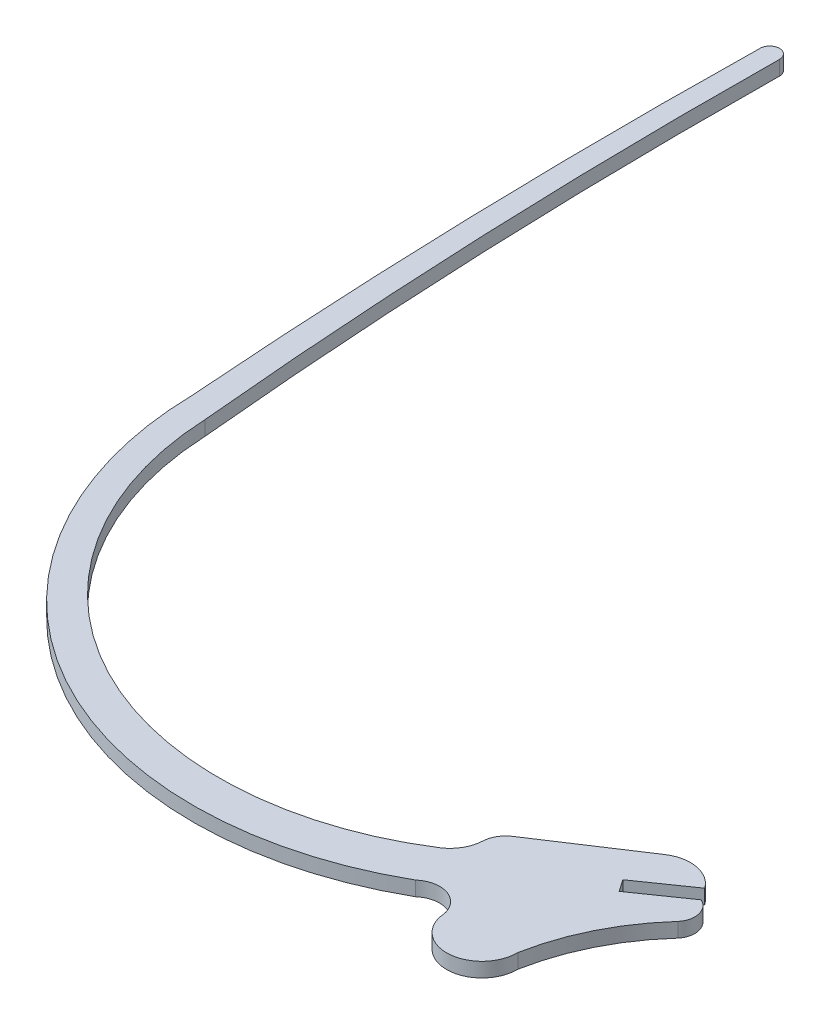
ISO-10303-21;
HEADER;
FILE_DESCRIPTION(('STEP AP214'),'2;1');
FILE_NAME('part.step','',(''),(''),'','','');
FILE_SCHEMA(('AUTOMOTIVE_DESIGN { 1 0 10303 214 1 1 1 1 }'));
ENDSEC;
DATA;
#1=APPLICATION_CONTEXT('core data for automotive mechanical design processes');
#2=APPLICATION_PROTOCOL_DEFINITION('international standard','automotive_design',2000,#1);
#3=PRODUCT_CONTEXT('',#1,'mechanical');
#4=PRODUCT('Part','Part','',(#3));
#5=PRODUCT_RELATED_PRODUCT_CATEGORY('part','',(#4));
#6=PRODUCT_DEFINITION_FORMATION('','',#4);
#7=PRODUCT_DEFINITION_CONTEXT('part definition',#1,'design');
#8=PRODUCT_DEFINITION('design','',#6,#7);
#9=PRODUCT_DEFINITION_SHAPE('','',#8);
#10=(LENGTH_UNIT() NAMED_UNIT(*) SI_UNIT(.MILLI.,.METRE.));
#11=(NAMED_UNIT(*) PLANE_ANGLE_UNIT() SI_UNIT($,.RADIAN.));
#12=(NAMED_UNIT(*) SI_UNIT($,.STERADIAN.) SOLID_ANGLE_UNIT());
#13=UNCERTAINTY_MEASURE_WITH_UNIT(LENGTH_MEASURE(1.E-05),#10,'distance_accuracy_value','');
#14=(GEOMETRIC_REPRESENTATION_CONTEXT(3) GLOBAL_UNCERTAINTY_ASSIGNED_CONTEXT((#13)) GLOBAL_UNIT_ASSIGNED_CONTEXT((#10,
#11,#12)) REPRESENTATION_CONTEXT('',''));
#15=CARTESIAN_POINT('',(0.,0.,0.));
#16=DIRECTION('',(0.,0.,1.));
#17=DIRECTION('',(1.,0.,0.));
#18=AXIS2_PLACEMENT_3D('',#15,#16,#17);
#19=CARTESIAN_POINT('',(-41670.167335459,3.,-18203.6307407563));
#20=DIRECTION('',(0.,-1.,0.));
#21=DIRECTION('',(0.,0.,-1.));
#22=AXIS2_PLACEMENT_3D('',#19,#20,#21);
#23=CYLINDRICAL_SURFACE('',#22,7.45711301170732);
#24=CARTESIAN_POINT('',(-41670.167335459,0.,-18203.6307407563));
#25=DIRECTION('',(0.,1.,0.));
#26=DIRECTION('',(0.,0.,1.));
#27=AXIS2_PLACEMENT_3D('',#24,#25,#26);
#28=CIRCLE('',#27,7.45711301170732);
#29=CARTESIAN_POINT('',(-41664.097656,0.,-18207.962891));
#30=VERTEX_POINT('',#29);
#31=CARTESIAN_POINT('',(-41674.261719,0.,-18209.863281));
#32=VERTEX_POINT('',#31);
#33=EDGE_CURVE('E185',#30,#32,#28,.T.);
#34=ORIENTED_EDGE('',*,*,#33,.T.);
#35=DIRECTION('',(0.,-1.,0.));
#36=VECTOR('',#35,1.);
#37=CARTESIAN_POINT('',(-41674.261719,3.,-18209.863281));
#38=LINE('',#37,#36);
#39=CARTESIAN_POINT('',(-41674.261719,3.,-18209.863281));
#40=VERTEX_POINT('',#39);
#41=EDGE_CURVE('E11',#40,#32,#38,.T.);
#42=ORIENTED_EDGE('',*,*,#41,.F.);
#43=CARTESIAN_POINT('',(-41670.167335459,3.,-18203.6307407563));
#44=DIRECTION('',(0.,1.,0.));
#45=DIRECTION('',(0.,0.,1.));
#46=AXIS2_PLACEMENT_3D('',#43,#44,#45);
#47=CIRCLE('',#46,7.45711301170732);
#48=CARTESIAN_POINT('',(-41664.097656,3.,-18207.962891));
#49=VERTEX_POINT('',#48);
#50=EDGE_CURVE('E217',#49,#40,#47,.T.);
#51=ORIENTED_EDGE('',*,*,#50,.F.);
#52=DIRECTION('',(0.,-1.,0.));
#53=VECTOR('',#52,1.);
#54=CARTESIAN_POINT('',(-41664.097656,3.,-18207.962891));
#55=LINE('',#54,#53);
#56=EDGE_CURVE('E181',#49,#30,#55,.T.);
#57=ORIENTED_EDGE('',*,*,#56,.T.);
#58=EDGE_LOOP('',(#34,#42,#51,#57));
#59=FACE_BOUND('',#58,.T.);
#60=ADVANCED_FACE('F35',(#59),#23,.T.);
#61=CARTESIAN_POINT('',(-41693.266504,3.,-18197.371175));
#62=DIRECTION('',(0.549277602971163,0.,0.835639943321437));
#63=DIRECTION('',(0.835639943321437,0.,-0.549277602971163));
#64=AXIS2_PLACEMENT_3D('',#61,#62,#63);
#65=PLANE('',#64);
#66=DIRECTION('',(-0.835639943321437,0.,0.549277602971163));
#67=VECTOR('',#66,1.);
#68=CARTESIAN_POINT('',(-41693.266504,0.,-18197.371175));
#69=LINE('',#68,#67);
#70=CARTESIAN_POINT('',(-41693.266504,0.,-18197.3711750001));
#71=VERTEX_POINT('',#70);
#72=EDGE_CURVE('E188',#32,#71,#69,.T.);
#73=ORIENTED_EDGE('',*,*,#72,.T.);
#74=DIRECTION('',(0.,-1.,0.));
#75=VECTOR('',#74,1.);
#76=CARTESIAN_POINT('',(-41693.266504,3.,-18197.3711750001));
#77=LINE('',#76,#75);
#78=CARTESIAN_POINT('',(-41693.266504,3.,-18197.3711750001));
#79=VERTEX_POINT('',#78);
#80=EDGE_CURVE('E43',#79,#71,#77,.T.);
#81=ORIENTED_EDGE('',*,*,#80,.F.);
#82=DIRECTION('',(-0.835639943321437,0.,0.549277602971163));
#83=VECTOR('',#82,1.);
#84=CARTESIAN_POINT('',(-41693.266504,3.,-18197.371175));
#85=LINE('',#84,#83);
#86=EDGE_CURVE('E121',#40,#79,#85,.T.);
#87=ORIENTED_EDGE('',*,*,#86,.F.);
#88=ORIENTED_EDGE('',*,*,#41,.T.);
#89=EDGE_LOOP('',(#73,#81,#87,#88));
#90=FACE_BOUND('',#89,.T.);
#91=ADVANCED_FACE('F320',(#90),#65,.F.);
#92=CARTESIAN_POINT('',(-41690.5203135269,3.,-18193.1919860842));
#93=DIRECTION('',(0.,-1.,0.));
#94=DIRECTION('',(0.,0.,-1.));
#95=AXIS2_PLACEMENT_3D('',#92,#93,#94);
#96=CYLINDRICAL_SURFACE('',#95,5.00071815931447);
#97=CARTESIAN_POINT('',(-41690.5203135269,0.,-18193.1919860842));
#98=DIRECTION('',(0.,1.,0.));
#99=DIRECTION('',(0.,0.,1.));
#100=AXIS2_PLACEMENT_3D('',#97,#98,#99);
#101=CIRCLE('',#100,5.00071815931447);
#102=CARTESIAN_POINT('',(-41695.515589,0.,-18193.425235));
#103=VERTEX_POINT('',#102);
#104=EDGE_CURVE('E190',#71,#103,#101,.T.);
#105=ORIENTED_EDGE('',*,*,#104,.T.);
#106=DIRECTION('',(0.,-1.,0.));
#107=VECTOR('',#106,1.);
#108=CARTESIAN_POINT('',(-41695.515589,3.,-18193.425235));
#109=LINE('',#108,#107);
#110=CARTESIAN_POINT('',(-41695.515589,3.,-18193.425235));
#111=VERTEX_POINT('',#110);
#112=EDGE_CURVE('E251',#111,#103,#109,.T.);
#113=ORIENTED_EDGE('',*,*,#112,.F.);
#114=CARTESIAN_POINT('',(-41690.5203135269,3.,-18193.1919860842));
#115=DIRECTION('',(0.,1.,0.));
#116=DIRECTION('',(0.,0.,1.));
#117=AXIS2_PLACEMENT_3D('',#114,#115,#116);
#118=CIRCLE('',#117,5.00071815931447);
#119=EDGE_CURVE('E259',#79,#111,#118,.T.);
#120=ORIENTED_EDGE('',*,*,#119,.F.);
#121=ORIENTED_EDGE('',*,*,#80,.T.);
#122=EDGE_LOOP('',(#105,#113,#120,#121));
#123=FACE_BOUND('',#122,.T.);
#124=ADVANCED_FACE('F257',(#123),#96,.T.);
#125=CARTESIAN_POINT('',(-41702.5818313739,3.,-18193.7542508718));
#126=DIRECTION('',(0.,-1.,0.));
#127=DIRECTION('',(0.,0.,-1.));
#128=AXIS2_PLACEMENT_3D('',#125,#126,#127);
#129=CYLINDRICAL_SURFACE('',#128,7.07389798699891);
#130=CARTESIAN_POINT('',(-41702.5818313739,0.,-18193.7542508718));
#131=DIRECTION('',(0.,-1.,0.));
#132=DIRECTION('',(0.,0.,1.));
#133=AXIS2_PLACEMENT_3D('',#130,#131,#132);
#134=CIRCLE('',#133,7.07389798699891);
#135=CARTESIAN_POINT('',(-41698.7770929999,0.,-18187.790695));
#136=VERTEX_POINT('',#135);
#137=EDGE_CURVE('E192',#103,#136,#134,.T.);
#138=ORIENTED_EDGE('',*,*,#137,.T.);
#139=DIRECTION('',(0.,-1.,0.));
#140=VECTOR('',#139,1.);
#141=CARTESIAN_POINT('',(-41698.7770929999,3.,-18187.790695));
#142=LINE('',#141,#140);
#143=CARTESIAN_POINT('',(-41698.7770929999,3.,-18187.790695));
#144=VERTEX_POINT('',#143);
#145=EDGE_CURVE('E248',#144,#136,#142,.T.);
#146=ORIENTED_EDGE('',*,*,#145,.F.);
#147=CARTESIAN_POINT('',(-41702.5818313739,3.,-18193.7542508718));
#148=DIRECTION('',(0.,-1.,0.));
#149=DIRECTION('',(0.,0.,1.));
#150=AXIS2_PLACEMENT_3D('',#147,#148,#149);
#151=CIRCLE('',#150,7.07389798699891);
#152=EDGE_CURVE('E277',#111,#144,#151,.T.);
#153=ORIENTED_EDGE('',*,*,#152,.F.);
#154=ORIENTED_EDGE('',*,*,#112,.T.);
#155=EDGE_LOOP('',(#138,#146,#153,#154));
#156=FACE_BOUND('',#155,.T.);
#157=ADVANCED_FACE('F268',(#156),#129,.F.);
#158=CARTESIAN_POINT('',(-41734.1210727432,3.,-18243.1972549701));
#159=DIRECTION('',(0.,-1.,0.));
#160=DIRECTION('',(0.,0.,-1.));
#161=AXIS2_PLACEMENT_3D('',#158,#159,#160);
#162=CYLINDRICAL_SURFACE('',#161,65.7197366992027);
#163=CARTESIAN_POINT('',(-41734.1210727432,0.,-18243.1972549701));
#164=DIRECTION('',(0.,-1.,0.));
#165=DIRECTION('',(0.,0.,1.));
#166=AXIS2_PLACEMENT_3D('',#163,#164,#165);
#167=CIRCLE('',#166,65.7197366992027);
#168=CARTESIAN_POINT('',(-41799.7722559999,0.,-18240.1962669992));
#169=VERTEX_POINT('',#168);
#170=EDGE_CURVE('E194',#136,#169,#167,.T.);
#171=ORIENTED_EDGE('',*,*,#170,.T.);
#172=DIRECTION('',(0.,-1.,0.));
#173=VECTOR('',#172,1.);
#174=CARTESIAN_POINT('',(-41799.7722559999,3.,-18240.1962669992));
#175=LINE('',#174,#173);
#176=CARTESIAN_POINT('',(-41799.7722559999,3.,-18240.1962669992));
#177=VERTEX_POINT('',#176);
#178=EDGE_CURVE('E245',#177,#169,#175,.T.);
#179=ORIENTED_EDGE('',*,*,#178,.F.);
#180=CARTESIAN_POINT('',(-41734.1210727432,3.,-18243.1972549701));
#181=DIRECTION('',(0.,-1.,0.));
#182=DIRECTION('',(0.,0.,1.));
#183=AXIS2_PLACEMENT_3D('',#180,#181,#182);
#184=CIRCLE('',#183,65.7197366992027);
#185=EDGE_CURVE('E274',#144,#177,#184,.T.);
#186=ORIENTED_EDGE('',*,*,#185,.F.);
#187=ORIENTED_EDGE('',*,*,#145,.T.);
#188=EDGE_LOOP('',(#171,#179,#186,#187));
#189=FACE_BOUND('',#188,.T.);
#190=ADVANCED_FACE('F272',(#189),#162,.F.);
#191=CARTESIAN_POINT('',(-40643.9922011501,3.,-18349.9280772453));
#192=DIRECTION('',(0.,-1.,0.));
#193=DIRECTION('',(0.,0.,-1.));
#194=AXIS2_PLACEMENT_3D('',#191,#192,#193);
#195=CYLINDRICAL_SURFACE('',#194,1160.97743534);
#196=CARTESIAN_POINT('',(-40643.9922011501,0.,-18349.9280772453));
#197=DIRECTION('',(0.,-1.,0.));
#198=DIRECTION('',(0.,0.,1.));
#199=AXIS2_PLACEMENT_3D('',#196,#197,#198);
#200=CIRCLE('',#199,1160.97743534);
#201=CARTESIAN_POINT('',(-41804.882129,0.,-18364.182227));
#202=VERTEX_POINT('',#201);
#203=EDGE_CURVE('E196',#169,#202,#200,.T.);
#204=ORIENTED_EDGE('',*,*,#203,.T.);
#205=DIRECTION('',(0.,-1.,0.));
#206=VECTOR('',#205,1.);
#207=CARTESIAN_POINT('',(-41804.882129,3.,-18364.182227));
#208=LINE('',#207,#206);
#209=CARTESIAN_POINT('',(-41804.882129,3.,-18364.182227));
#210=VERTEX_POINT('',#209);
#211=EDGE_CURVE('E242',#210,#202,#208,.T.);
#212=ORIENTED_EDGE('',*,*,#211,.F.);
#213=CARTESIAN_POINT('',(-40643.9922011501,3.,-18349.9280772453));
#214=DIRECTION('',(0.,-1.,0.));
#215=DIRECTION('',(0.,0.,1.));
#216=AXIS2_PLACEMENT_3D('',#213,#214,#215);
#217=CIRCLE('',#216,1160.97743534);
#218=EDGE_CURVE('E276',#177,#210,#217,.T.);
#219=ORIENTED_EDGE('',*,*,#218,.F.);
#220=ORIENTED_EDGE('',*,*,#178,.T.);
#221=EDGE_LOOP('',(#204,#212,#219,#220));
#222=FACE_BOUND('',#221,.T.);
#223=ADVANCED_FACE('F333',(#222),#195,.F.);
#224=CARTESIAN_POINT('',(-41806.879844595,3.,-18364.2070715257));
#225=DIRECTION('',(0.,-1.,0.));
#226=DIRECTION('',(0.,0.,-1.));
#227=AXIS2_PLACEMENT_3D('',#224,#225,#226);
#228=CYLINDRICAL_SURFACE('',#227,1.99787007809833);
#229=CARTESIAN_POINT('',(-41806.879844595,0.,-18364.2070715257));
#230=DIRECTION('',(0.,1.,0.));
#231=DIRECTION('',(0.,0.,1.));
#232=AXIS2_PLACEMENT_3D('',#229,#230,#231);
#233=CIRCLE('',#232,1.99787007809833);
#234=CARTESIAN_POINT('',(-41808.872267,0.,-18364.354509));
#235=VERTEX_POINT('',#234);
#236=EDGE_CURVE('E198',#202,#235,#233,.T.);
#237=ORIENTED_EDGE('',*,*,#236,.T.);
#238=DIRECTION('',(0.,-1.,0.));
#239=VECTOR('',#238,1.);
#240=CARTESIAN_POINT('',(-41808.872267,3.,-18364.354509));
#241=LINE('',#240,#239);
#242=CARTESIAN_POINT('',(-41808.872267,3.,-18364.354509));
#243=VERTEX_POINT('',#242);
#244=EDGE_CURVE('E239',#243,#235,#241,.T.);
#245=ORIENTED_EDGE('',*,*,#244,.F.);
#246=CARTESIAN_POINT('',(-41806.879844595,3.,-18364.2070715257));
#247=DIRECTION('',(0.,1.,0.));
#248=DIRECTION('',(0.,0.,1.));
#249=AXIS2_PLACEMENT_3D('',#246,#247,#248);
#250=CIRCLE('',#249,1.99787007809833);
#251=EDGE_CURVE('E279',#210,#243,#250,.T.);
#252=ORIENTED_EDGE('',*,*,#251,.F.);
#253=ORIENTED_EDGE('',*,*,#211,.T.);
#254=EDGE_LOOP('',(#237,#245,#252,#253));
#255=FACE_BOUND('',#254,.T.);
#256=ADVANCED_FACE('F336',(#255),#228,.T.);
#257=CARTESIAN_POINT('',(-40509.0392705955,3.,-18340.4780748377));
#258=DIRECTION('',(0.,-1.,0.));
#259=DIRECTION('',(0.,0.,-1.));
#260=AXIS2_PLACEMENT_3D('',#257,#258,#259);
#261=CYLINDRICAL_SURFACE('',#260,1300.0522691993);
#262=CARTESIAN_POINT('',(-40509.0392705955,0.,-18340.4780748377));
#263=DIRECTION('',(0.,1.,0.));
#264=DIRECTION('',(0.,0.,1.));
#265=AXIS2_PLACEMENT_3D('',#262,#263,#264);
#266=CIRCLE('',#265,1300.0522691993);
#267=CARTESIAN_POINT('',(-41805.442287,0.,-18243.1378379998));
#268=VERTEX_POINT('',#267);
#269=EDGE_CURVE('E200',#235,#268,#266,.T.);
#270=ORIENTED_EDGE('',*,*,#269,.T.);
#271=DIRECTION('',(0.,-1.,0.));
#272=VECTOR('',#271,1.);
#273=CARTESIAN_POINT('',(-41805.442287,3.,-18243.1378379998));
#274=LINE('',#273,#272);
#275=CARTESIAN_POINT('',(-41805.442287,3.,-18243.1378379998));
#276=VERTEX_POINT('',#275);
#277=EDGE_CURVE('E236',#276,#268,#274,.T.);
#278=ORIENTED_EDGE('',*,*,#277,.F.);
#279=CARTESIAN_POINT('',(-40509.0392705955,3.,-18340.4780748377));
#280=DIRECTION('',(0.,1.,0.));
#281=DIRECTION('',(0.,0.,1.));
#282=AXIS2_PLACEMENT_3D('',#279,#280,#281);
#283=CIRCLE('',#282,1300.0522691993);
#284=EDGE_CURVE('E285',#243,#276,#283,.T.);
#285=ORIENTED_EDGE('',*,*,#284,.F.);
#286=ORIENTED_EDGE('',*,*,#244,.T.);
#287=EDGE_LOOP('',(#270,#278,#285,#286));
#288=FACE_BOUND('',#287,.T.);
#289=ADVANCED_FACE('F340',(#288),#261,.T.);
#290=CARTESIAN_POINT('',(-41729.0621741269,3.,-18244.5690325982));
#291=DIRECTION('',(0.,-1.,0.));
#292=DIRECTION('',(0.,0.,-1.));
#293=AXIS2_PLACEMENT_3D('',#290,#291,#292);
#294=CYLINDRICAL_SURFACE('',#293,76.3935204089968);
#295=CARTESIAN_POINT('',(-41729.0621741269,0.,-18244.5690325982));
#296=DIRECTION('',(0.,1.,0.));
#297=DIRECTION('',(0.,0.,1.));
#298=AXIS2_PLACEMENT_3D('',#295,#296,#297);
#299=CIRCLE('',#298,76.3935204089968);
#300=CARTESIAN_POINT('',(-41796.8202680001,0.,-18209.2871580001));
#301=VERTEX_POINT('',#300);
#302=EDGE_CURVE('E202',#268,#301,#299,.T.);
#303=ORIENTED_EDGE('',*,*,#302,.T.);
#304=DIRECTION('',(0.,-1.,0.));
#305=VECTOR('',#304,1.);
#306=CARTESIAN_POINT('',(-41796.8202680001,3.,-18209.2871580001));
#307=LINE('',#306,#305);
#308=CARTESIAN_POINT('',(-41796.8202680001,3.,-18209.2871580001));
#309=VERTEX_POINT('',#308);
#310=EDGE_CURVE('E233',#309,#301,#307,.T.);
#311=ORIENTED_EDGE('',*,*,#310,.F.);
#312=CARTESIAN_POINT('',(-41729.0621741269,3.,-18244.5690325982));
#313=DIRECTION('',(0.,1.,0.));
#314=DIRECTION('',(0.,0.,1.));
#315=AXIS2_PLACEMENT_3D('',#312,#313,#314);
#316=CIRCLE('',#315,76.3935204089968);
#317=EDGE_CURVE('E287',#276,#309,#316,.T.);
#318=ORIENTED_EDGE('',*,*,#317,.F.);
#319=ORIENTED_EDGE('',*,*,#277,.T.);
#320=EDGE_LOOP('',(#303,#311,#318,#319));
#321=FACE_BOUND('',#320,.T.);
#322=ADVANCED_FACE('F344',(#321),#294,.T.);
#323=CARTESIAN_POINT('',(-41731.8291687324,3.,-18243.1292127379));
#324=DIRECTION('',(0.,-1.,0.));
#325=DIRECTION('',(0.,0.,-1.));
#326=AXIS2_PLACEMENT_3D('',#323,#324,#325);
#327=CYLINDRICAL_SURFACE('',#326,73.2743314736263);
#328=CARTESIAN_POINT('',(-41731.8291687324,0.,-18243.1292127379));
#329=DIRECTION('',(0.,1.,0.));
#330=DIRECTION('',(0.,0.,1.));
#331=AXIS2_PLACEMENT_3D('',#328,#329,#330);
#332=CIRCLE('',#331,73.2743314736263);
#333=CARTESIAN_POINT('',(-41695.481924,0.,-18179.5052749999));
#334=VERTEX_POINT('',#333);
#335=EDGE_CURVE('E204',#301,#334,#332,.T.);
#336=ORIENTED_EDGE('',*,*,#335,.T.);
#337=DIRECTION('',(0.,-1.,0.));
#338=VECTOR('',#337,1.);
#339=CARTESIAN_POINT('',(-41695.481924,3.,-18179.5052749999));
#340=LINE('',#339,#338);
#341=CARTESIAN_POINT('',(-41695.481924,3.,-18179.5052749999));
#342=VERTEX_POINT('',#341);
#343=EDGE_CURVE('E230',#342,#334,#340,.T.);
#344=ORIENTED_EDGE('',*,*,#343,.F.);
#345=CARTESIAN_POINT('',(-41731.8291687324,3.,-18243.1292127379));
#346=DIRECTION('',(0.,1.,0.));
#347=DIRECTION('',(0.,0.,1.));
#348=AXIS2_PLACEMENT_3D('',#345,#346,#347);
#349=CIRCLE('',#348,73.2743314736263);
#350=EDGE_CURVE('E289',#309,#342,#349,.T.);
#351=ORIENTED_EDGE('',*,*,#350,.F.);
#352=ORIENTED_EDGE('',*,*,#310,.T.);
#353=EDGE_LOOP('',(#336,#344,#351,#352));
#354=FACE_BOUND('',#353,.T.);
#355=ADVANCED_FACE('F348',(#354),#327,.T.);
#356=CARTESIAN_POINT('',(-41691.8619260375,3.,-18175.3744133712));
#357=DIRECTION('',(0.,-1.,0.));
#358=DIRECTION('',(0.,0.,-1.));
#359=AXIS2_PLACEMENT_3D('',#356,#357,#358);
#360=CYLINDRICAL_SURFACE('',#359,5.49257708590029);
#361=CARTESIAN_POINT('',(-41691.8619260375,0.,-18175.3744133712));
#362=DIRECTION('',(0.,-1.,0.));
#363=DIRECTION('',(0.,0.,1.));
#364=AXIS2_PLACEMENT_3D('',#361,#362,#363);
#365=CIRCLE('',#364,5.49257708590029);
#366=CARTESIAN_POINT('',(-41686.3725320001,0.,-18175.561379));
#367=VERTEX_POINT('',#366);
#368=EDGE_CURVE('E206',#334,#367,#365,.T.);
#369=ORIENTED_EDGE('',*,*,#368,.T.);
#370=DIRECTION('',(0.,-1.,0.));
#371=VECTOR('',#370,1.);
#372=CARTESIAN_POINT('',(-41686.3725320001,3.,-18175.561379));
#373=LINE('',#372,#371);
#374=CARTESIAN_POINT('',(-41686.3725320001,3.,-18175.561379));
#375=VERTEX_POINT('',#374);
#376=EDGE_CURVE('E227',#375,#367,#373,.T.);
#377=ORIENTED_EDGE('',*,*,#376,.F.);
#378=CARTESIAN_POINT('',(-41691.8619260375,3.,-18175.3744133712));
#379=DIRECTION('',(0.,-1.,0.));
#380=DIRECTION('',(0.,0.,1.));
#381=AXIS2_PLACEMENT_3D('',#378,#379,#380);
#382=CIRCLE('',#381,5.49257708590029);
#383=EDGE_CURVE('E291',#342,#375,#382,.T.);
#384=ORIENTED_EDGE('',*,*,#383,.F.);
#385=ORIENTED_EDGE('',*,*,#343,.T.);
#386=EDGE_LOOP('',(#369,#377,#384,#385));
#387=FACE_BOUND('',#386,.T.);
#388=ADVANCED_FACE('F352',(#387),#360,.F.);
#389=CARTESIAN_POINT('',(-41679.2044723837,3.,-18176.9783732278));
#390=DIRECTION('',(0.,-1.,0.));
#391=DIRECTION('',(0.,0.,-1.));
#392=AXIS2_PLACEMENT_3D('',#389,#390,#391);
#393=CYLINDRICAL_SURFACE('',#392,7.30677434342734);
#394=CARTESIAN_POINT('',(-41679.2044723837,0.,-18176.9783732278));
#395=DIRECTION('',(0.,1.,0.));
#396=DIRECTION('',(0.,0.,1.));
#397=AXIS2_PLACEMENT_3D('',#394,#395,#396);
#398=CIRCLE('',#397,7.30677434342734);
#399=CARTESIAN_POINT('',(-41671.89863,0.,-18177.095071));
#400=VERTEX_POINT('',#399);
#401=EDGE_CURVE('E208',#367,#400,#398,.T.);
#402=ORIENTED_EDGE('',*,*,#401,.T.);
#403=DIRECTION('',(0.,-1.,0.));
#404=VECTOR('',#403,1.);
#405=CARTESIAN_POINT('',(-41671.89863,3.,-18177.095071));
#406=LINE('',#405,#404);
#407=CARTESIAN_POINT('',(-41671.89863,3.,-18177.095071));
#408=VERTEX_POINT('',#407);
#409=EDGE_CURVE('E224',#408,#400,#406,.T.);
#410=ORIENTED_EDGE('',*,*,#409,.F.);
#411=CARTESIAN_POINT('',(-41679.2044723837,3.,-18176.9783732278));
#412=DIRECTION('',(0.,1.,0.));
#413=DIRECTION('',(0.,0.,1.));
#414=AXIS2_PLACEMENT_3D('',#411,#412,#413);
#415=CIRCLE('',#414,7.30677434342734);
#416=EDGE_CURVE('E293',#375,#408,#415,.T.);
#417=ORIENTED_EDGE('',*,*,#416,.F.);
#418=ORIENTED_EDGE('',*,*,#376,.T.);
#419=EDGE_LOOP('',(#402,#410,#417,#418));
#420=FACE_BOUND('',#419,.T.);
#421=ADVANCED_FACE('F356',(#420),#393,.T.);
#422=CARTESIAN_POINT('',(-41627.4001644738,3.,-18168.8129219768));
#423=DIRECTION('',(0.,-1.,0.));
#424=DIRECTION('',(0.,0.,-1.));
#425=AXIS2_PLACEMENT_3D('',#422,#423,#424);
#426=CYLINDRICAL_SURFACE('',#425,45.2626493549004);
#427=CARTESIAN_POINT('',(-41627.4001644738,0.,-18168.8129219768));
#428=DIRECTION('',(0.,-1.,0.));
#429=DIRECTION('',(0.,0.,1.));
#430=AXIS2_PLACEMENT_3D('',#427,#428,#429);
#431=CIRCLE('',#430,45.2626493549004);
#432=CARTESIAN_POINT('',(-41660.929052,0.,-18199.218861));
#433=VERTEX_POINT('',#432);
#434=EDGE_CURVE('E210',#400,#433,#431,.T.);
#435=ORIENTED_EDGE('',*,*,#434,.T.);
#436=DIRECTION('',(0.,-1.,0.));
#437=VECTOR('',#436,1.);
#438=CARTESIAN_POINT('',(-41660.929052,3.,-18199.218861));
#439=LINE('',#438,#437);
#440=CARTESIAN_POINT('',(-41660.929052,3.,-18199.218861));
#441=VERTEX_POINT('',#440);
#442=EDGE_CURVE('E221',#441,#433,#439,.T.);
#443=ORIENTED_EDGE('',*,*,#442,.F.);
#444=CARTESIAN_POINT('',(-41627.4001644738,3.,-18168.8129219768));
#445=DIRECTION('',(0.,-1.,0.));
#446=DIRECTION('',(0.,0.,1.));
#447=AXIS2_PLACEMENT_3D('',#444,#445,#446);
#448=CIRCLE('',#447,45.2626493549004);
#449=EDGE_CURVE('E295',#408,#441,#448,.T.);
#450=ORIENTED_EDGE('',*,*,#449,.F.);
#451=ORIENTED_EDGE('',*,*,#409,.T.);
#452=EDGE_LOOP('',(#435,#443,#450,#451));
#453=FACE_BOUND('',#452,.T.);
#454=ADVANCED_FACE('F301',(#453),#426,.F.);
#455=CARTESIAN_POINT('',(-41664.0234637754,3.,-18201.8126157224));
#456=DIRECTION('',(0.,-1.,0.));
#457=DIRECTION('',(0.,0.,-1.));
#458=AXIS2_PLACEMENT_3D('',#455,#456,#457);
#459=CYLINDRICAL_SURFACE('',#458,4.03769089900144);
#460=CARTESIAN_POINT('',(-41664.0234637754,0.,-18201.8126157224));
#461=DIRECTION('',(0.,1.,0.));
#462=DIRECTION('',(0.,0.,1.));
#463=AXIS2_PLACEMENT_3D('',#460,#461,#462);
#464=CIRCLE('',#463,4.03769089900144);
#465=CARTESIAN_POINT('',(-41662.382812,0.,-18205.501953));
#466=VERTEX_POINT('',#465);
#467=EDGE_CURVE('E212',#433,#466,#464,.T.);
#468=ORIENTED_EDGE('',*,*,#467,.T.);
#469=DIRECTION('',(0.,-1.,0.));
#470=VECTOR('',#469,1.);
#471=CARTESIAN_POINT('',(-41662.382812,3.,-18205.501953));
#472=LINE('',#471,#470);
#473=CARTESIAN_POINT('',(-41662.382812,3.,-18205.501953));
#474=VERTEX_POINT('',#473);
#475=EDGE_CURVE('E176',#474,#466,#472,.T.);
#476=ORIENTED_EDGE('',*,*,#475,.F.);
#477=CARTESIAN_POINT('',(-41664.0234637754,3.,-18201.8126157224));
#478=DIRECTION('',(0.,1.,0.));
#479=DIRECTION('',(0.,0.,1.));
#480=AXIS2_PLACEMENT_3D('',#477,#478,#479);
#481=CIRCLE('',#480,4.03769089900144);
#482=EDGE_CURVE('E167',#441,#474,#481,.T.);
#483=ORIENTED_EDGE('',*,*,#482,.F.);
#484=ORIENTED_EDGE('',*,*,#442,.T.);
#485=EDGE_LOOP('',(#468,#476,#483,#484));
#486=FACE_BOUND('',#485,.T.);
#487=ADVANCED_FACE('F305',(#486),#459,.T.);
#488=CARTESIAN_POINT('',(-41672.375,3.,-18198.541016));
#489=DIRECTION('',(0.571609417534446,0.,0.820525851991229));
#490=DIRECTION('',(0.820525851991229,0.,-0.571609417534446));
#491=AXIS2_PLACEMENT_3D('',#488,#489,#490);
#492=PLANE('',#491);
#493=DIRECTION('',(-0.820525851991229,0.,0.571609417534445));
#494=VECTOR('',#493,1.);
#495=CARTESIAN_POINT('',(-41672.375,0.,-18198.541016));
#496=LINE('',#495,#494);
#497=CARTESIAN_POINT('',(-41672.375,0.,-18198.541016));
#498=VERTEX_POINT('',#497);
#499=EDGE_CURVE('E175',#466,#498,#496,.T.);
#500=ORIENTED_EDGE('',*,*,#499,.T.);
#501=DIRECTION('',(0.,-1.,0.));
#502=VECTOR('',#501,1.);
#503=CARTESIAN_POINT('',(-41672.375,3.,-18198.541016));
#504=LINE('',#503,#502);
#505=CARTESIAN_POINT('',(-41672.375,3.,-18198.541016));
#506=VERTEX_POINT('',#505);
#507=EDGE_CURVE('E172',#506,#498,#504,.T.);
#508=ORIENTED_EDGE('',*,*,#507,.F.);
#509=DIRECTION('',(-0.820525851991229,0.,0.571609417534445));
#510=VECTOR('',#509,1.);
#511=CARTESIAN_POINT('',(-41672.375,3.,-18198.541016));
#512=LINE('',#511,#510);
#513=EDGE_CURVE('E161',#474,#506,#512,.T.);
#514=ORIENTED_EDGE('',*,*,#513,.F.);
#515=ORIENTED_EDGE('',*,*,#475,.T.);
#516=EDGE_LOOP('',(#500,#508,#514,#515));
#517=FACE_BOUND('',#516,.T.);
#518=ADVANCED_FACE('F173',(#517),#492,.F.);
#519=CARTESIAN_POINT('',(-41674.089844,3.,-18201.003906));
#520=DIRECTION('',(-0.82066625592994,0.,0.571407819668172));
#521=DIRECTION('',(0.571407819668172,0.,0.82066625592994));
#522=AXIS2_PLACEMENT_3D('',#519,#520,#521);
#523=PLANE('',#522);
#524=DIRECTION('',(-0.571407819668172,0.,-0.82066625592994));
#525=VECTOR('',#524,1.);
#526=CARTESIAN_POINT('',(-41674.089844,0.,-18201.003906));
#527=LINE('',#526,#525);
#528=CARTESIAN_POINT('',(-41674.089844,0.,-18201.003906));
#529=VERTEX_POINT('',#528);
#530=EDGE_CURVE('E107',#498,#529,#527,.T.);
#531=ORIENTED_EDGE('',*,*,#530,.T.);
#532=DIRECTION('',(0.,-1.,0.));
#533=VECTOR('',#532,1.);
#534=CARTESIAN_POINT('',(-41674.089844,3.,-18201.003906));
#535=LINE('',#534,#533);
#536=CARTESIAN_POINT('',(-41674.089844,3.,-18201.003906));
#537=VERTEX_POINT('',#536);
#538=EDGE_CURVE('E177',#537,#529,#535,.T.);
#539=ORIENTED_EDGE('',*,*,#538,.F.);
#540=DIRECTION('',(-0.571407819668172,0.,-0.82066625592994));
#541=VECTOR('',#540,1.);
#542=CARTESIAN_POINT('',(-41674.089844,3.,-18201.003906));
#543=LINE('',#542,#541);
#544=EDGE_CURVE('E165',#506,#537,#543,.T.);
#545=ORIENTED_EDGE('',*,*,#544,.F.);
#546=ORIENTED_EDGE('',*,*,#507,.T.);
#547=EDGE_LOOP('',(#531,#539,#545,#546));
#548=FACE_BOUND('',#547,.T.);
#549=ADVANCED_FACE('F179',(#548),#523,.F.);
#550=CARTESIAN_POINT('',(-41664.097656,3.,-18207.962891));
#551=DIRECTION('',(-0.571501484171464,0.,-0.820601031921002));
#552=DIRECTION('',(-0.820601031921002,0.,0.571501484171464));
#553=AXIS2_PLACEMENT_3D('',#550,#551,#552);
#554=PLANE('',#553);
#555=DIRECTION('',(0.820601031921002,0.,-0.571501484171464));
#556=VECTOR('',#555,1.);
#557=CARTESIAN_POINT('',(-41664.097656,0.,-18207.962891));
#558=LINE('',#557,#556);
#559=EDGE_CURVE('E113',#529,#30,#558,.T.);
#560=ORIENTED_EDGE('',*,*,#559,.T.);
#561=ORIENTED_EDGE('',*,*,#56,.F.);
#562=DIRECTION('',(0.820601031921002,0.,-0.571501484171464));
#563=VECTOR('',#562,1.);
#564=CARTESIAN_POINT('',(-41664.097656,3.,-18207.962891));
#565=LINE('',#564,#563);
#566=EDGE_CURVE('E51',#537,#49,#565,.T.);
#567=ORIENTED_EDGE('',*,*,#566,.F.);
#568=ORIENTED_EDGE('',*,*,#538,.T.);
#569=EDGE_LOOP('',(#560,#561,#567,#568));
#570=FACE_BOUND('',#569,.T.);
#571=ADVANCED_FACE('F309',(#570),#554,.F.);
#572=CARTESIAN_POINT('',(-41670.167335459,3.,-18203.6307407563));
#573=DIRECTION('',(0.,1.,0.));
#574=DIRECTION('',(0.,0.,1.));
#575=AXIS2_PLACEMENT_3D('',#572,#573,#574);
#576=PLANE('',#575);
#577=ORIENTED_EDGE('',*,*,#50,.T.);
#578=ORIENTED_EDGE('',*,*,#86,.T.);
#579=ORIENTED_EDGE('',*,*,#119,.T.);
#580=ORIENTED_EDGE('',*,*,#152,.T.);
#581=ORIENTED_EDGE('',*,*,#185,.T.);
#582=ORIENTED_EDGE('',*,*,#218,.T.);
#583=ORIENTED_EDGE('',*,*,#251,.T.);
#584=ORIENTED_EDGE('',*,*,#284,.T.);
#585=ORIENTED_EDGE('',*,*,#317,.T.);
#586=ORIENTED_EDGE('',*,*,#350,.T.);
#587=ORIENTED_EDGE('',*,*,#383,.T.);
#588=ORIENTED_EDGE('',*,*,#416,.T.);
#589=ORIENTED_EDGE('',*,*,#449,.T.);
#590=ORIENTED_EDGE('',*,*,#482,.T.);
#591=ORIENTED_EDGE('',*,*,#513,.T.);
#592=ORIENTED_EDGE('',*,*,#544,.T.);
#593=ORIENTED_EDGE('',*,*,#566,.T.);
#594=EDGE_LOOP('',(#577,#578,#579,#580,#581,#582,#583,#584,#585,#586,#587,#588,#589,#590,#591,
#592,#593));
#595=FACE_BOUND('',#594,.T.);
#596=ADVANCED_FACE('F163',(#595),#576,.T.);
#597=CARTESIAN_POINT('',(-41670.167335459,0.,-18203.6307407563));
#598=DIRECTION('',(0.,1.,0.));
#599=DIRECTION('',(0.,0.,1.));
#600=AXIS2_PLACEMENT_3D('',#597,#598,#599);
#601=PLANE('',#600);
#602=ORIENTED_EDGE('',*,*,#33,.F.);
#603=ORIENTED_EDGE('',*,*,#559,.F.);
#604=ORIENTED_EDGE('',*,*,#530,.F.);
#605=ORIENTED_EDGE('',*,*,#499,.F.);
#606=ORIENTED_EDGE('',*,*,#467,.F.);
#607=ORIENTED_EDGE('',*,*,#434,.F.);
#608=ORIENTED_EDGE('',*,*,#401,.F.);
#609=ORIENTED_EDGE('',*,*,#368,.F.);
#610=ORIENTED_EDGE('',*,*,#335,.F.);
#611=ORIENTED_EDGE('',*,*,#302,.F.);
#612=ORIENTED_EDGE('',*,*,#269,.F.);
#613=ORIENTED_EDGE('',*,*,#236,.F.);
#614=ORIENTED_EDGE('',*,*,#203,.F.);
#615=ORIENTED_EDGE('',*,*,#170,.F.);
#616=ORIENTED_EDGE('',*,*,#137,.F.);
#617=ORIENTED_EDGE('',*,*,#104,.F.);
#618=ORIENTED_EDGE('',*,*,#72,.F.);
#619=EDGE_LOOP('',(#602,#603,#604,#605,#606,#607,#608,#609,#610,#611,#612,#613,#614,#615,#616,
#617,#618));
#620=FACE_BOUND('',#619,.T.);
#621=ADVANCED_FACE('F263',(#620),#601,.F.);
#622=CLOSED_SHELL('',(#60,#91,#124,#157,#190,#223,#256,#289,#322,#355,#388,#421,#454,#487,#518,
#549,#571,#596,#621));
#623=MANIFOLD_SOLID_BREP('B2',#622);
#624=ADVANCED_BREP_SHAPE_REPRESENTATION('',(#18,#623),#14);
#625=SHAPE_DEFINITION_REPRESENTATION(#9,#624);
ENDSEC;
END-ISO-10303-21;
